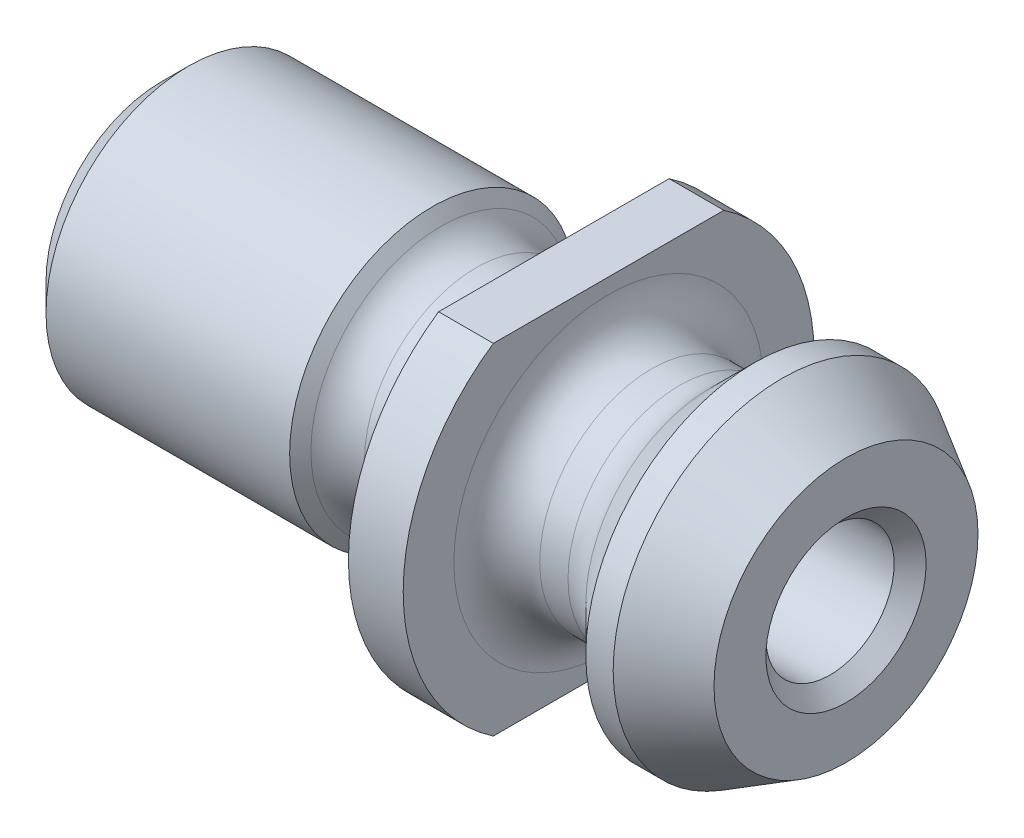
ISO-10303-21;
HEADER;
FILE_DESCRIPTION(('STEP AP214'),'2;1');
FILE_NAME('part.step','',(''),(''),'','','');
FILE_SCHEMA(('AUTOMOTIVE_DESIGN { 1 0 10303 214 1 1 1 1 }'));
ENDSEC;
DATA;
#1=APPLICATION_CONTEXT('core data for automotive mechanical design processes');
#2=APPLICATION_PROTOCOL_DEFINITION('international standard','automotive_design',2000,#1);
#3=PRODUCT_CONTEXT('',#1,'mechanical');
#4=PRODUCT('Part','Part','',(#3));
#5=PRODUCT_RELATED_PRODUCT_CATEGORY('part','',(#4));
#6=PRODUCT_DEFINITION_FORMATION('','',#4);
#7=PRODUCT_DEFINITION_CONTEXT('part definition',#1,'design');
#8=PRODUCT_DEFINITION('design','',#6,#7);
#9=PRODUCT_DEFINITION_SHAPE('','',#8);
#10=(LENGTH_UNIT() NAMED_UNIT(*) SI_UNIT(.MILLI.,.METRE.));
#11=(NAMED_UNIT(*) PLANE_ANGLE_UNIT() SI_UNIT($,.RADIAN.));
#12=(NAMED_UNIT(*) SI_UNIT($,.STERADIAN.) SOLID_ANGLE_UNIT());
#13=UNCERTAINTY_MEASURE_WITH_UNIT(LENGTH_MEASURE(1.E-05),#10,'distance_accuracy_value','');
#14=(GEOMETRIC_REPRESENTATION_CONTEXT(3) GLOBAL_UNCERTAINTY_ASSIGNED_CONTEXT((#13)) GLOBAL_UNIT_ASSIGNED_CONTEXT((#10,
#11,#12)) REPRESENTATION_CONTEXT('',''));
#15=CARTESIAN_POINT('',(0.,0.,0.));
#16=DIRECTION('',(0.,0.,1.));
#17=DIRECTION('',(1.,0.,0.));
#18=AXIS2_PLACEMENT_3D('',#15,#16,#17);
#19=CARTESIAN_POINT('',(-19.05,9.4615,0.));
#20=DIRECTION('',(0.,-1.,0.));
#21=DIRECTION('',(0.,0.,-1.));
#22=AXIS2_PLACEMENT_3D('',#19,#20,#21);
#23=PLANE('',#22);
#24=DIRECTION('',(0.,0.,-1.));
#25=VECTOR('',#24,1.);
#26=CARTESIAN_POINT('',(-16.256,9.4615,0.));
#27=LINE('',#26,#25);
#28=CARTESIAN_POINT('',(-16.256,9.4615,-6.41287125630945));
#29=VERTEX_POINT('',#28);
#30=CARTESIAN_POINT('',(-16.256,9.4615,6.41287125630945));
#31=VERTEX_POINT('',#30);
#32=EDGE_CURVE('E127',#29,#31,#27,.F.);
#33=ORIENTED_EDGE('',*,*,#32,.T.);
#34=DIRECTION('',(-1.,0.,0.));
#35=VECTOR('',#34,1.);
#36=CARTESIAN_POINT('',(-38.1,9.4615,6.41287125630945));
#37=LINE('',#36,#35);
#38=CARTESIAN_POINT('',(-13.208,9.4615,6.41287125630945));
#39=VERTEX_POINT('',#38);
#40=EDGE_CURVE('E252',#39,#31,#37,.T.);
#41=ORIENTED_EDGE('',*,*,#40,.F.);
#42=DIRECTION('',(0.,0.,1.));
#43=VECTOR('',#42,1.);
#44=CARTESIAN_POINT('',(-13.208,9.4615,0.));
#45=LINE('',#44,#43);
#46=CARTESIAN_POINT('',(-13.208,9.4615,-6.41287125630945));
#47=VERTEX_POINT('',#46);
#48=EDGE_CURVE('E74',#39,#47,#45,.F.);
#49=ORIENTED_EDGE('',*,*,#48,.T.);
#50=DIRECTION('',(-1.,0.,0.));
#51=VECTOR('',#50,1.);
#52=CARTESIAN_POINT('',(-38.1,9.4615,-6.41287125630945));
#53=LINE('',#52,#51);
#54=EDGE_CURVE('E53',#29,#47,#53,.F.);
#55=ORIENTED_EDGE('',*,*,#54,.F.);
#56=EDGE_LOOP('',(#33,#41,#49,#55));
#57=FACE_BOUND('',#56,.T.);
#58=ADVANCED_FACE('F16',(#57),#23,.F.);
#59=CARTESIAN_POINT('',(-38.1,0.,0.));
#60=DIRECTION('',(-1.,0.,0.));
#61=DIRECTION('',(0.,0.,1.));
#62=AXIS2_PLACEMENT_3D('',#59,#60,#61);
#63=CYLINDRICAL_SURFACE('',#62,11.43);
#64=ORIENTED_EDGE('',*,*,#40,.T.);
#65=CARTESIAN_POINT('',(-16.256,0.,0.));
#66=DIRECTION('',(-1.,0.,0.));
#67=DIRECTION('',(0.,0.,1.));
#68=AXIS2_PLACEMENT_3D('',#65,#66,#67);
#69=CIRCLE('',#68,11.43);
#70=CARTESIAN_POINT('',(-16.256,-9.4615,6.41287125630945));
#71=VERTEX_POINT('',#70);
#72=EDGE_CURVE('E126',#31,#71,#69,.F.);
#73=ORIENTED_EDGE('',*,*,#72,.T.);
#74=DIRECTION('',(1.,0.,0.));
#75=VECTOR('',#74,1.);
#76=CARTESIAN_POINT('',(-19.05,-9.4615,6.41287125630945));
#77=LINE('',#76,#75);
#78=CARTESIAN_POINT('',(-13.208,-9.4615,6.41287125630945));
#79=VERTEX_POINT('',#78);
#80=EDGE_CURVE('E63',#71,#79,#77,.T.);
#81=ORIENTED_EDGE('',*,*,#80,.T.);
#82=CARTESIAN_POINT('',(-13.208,0.,0.));
#83=DIRECTION('',(-1.,0.,0.));
#84=DIRECTION('',(0.,0.,1.));
#85=AXIS2_PLACEMENT_3D('',#82,#83,#84);
#86=CIRCLE('',#85,11.43);
#87=EDGE_CURVE('E71',#79,#39,#86,.T.);
#88=ORIENTED_EDGE('',*,*,#87,.T.);
#89=EDGE_LOOP('',(#64,#73,#81,#88));
#90=FACE_BOUND('',#89,.T.);
#91=ADVANCED_FACE('F153',(#90),#63,.T.);
#92=CARTESIAN_POINT('',(-19.05,-9.4615,0.));
#93=DIRECTION('',(0.,1.,0.));
#94=DIRECTION('',(0.,0.,1.));
#95=AXIS2_PLACEMENT_3D('',#92,#93,#94);
#96=PLANE('',#95);
#97=DIRECTION('',(0.,0.,-1.));
#98=VECTOR('',#97,1.);
#99=CARTESIAN_POINT('',(-16.256,-9.4615,0.));
#100=LINE('',#99,#98);
#101=CARTESIAN_POINT('',(-16.256,-9.4615,-6.41287125630945));
#102=VERTEX_POINT('',#101);
#103=EDGE_CURVE('E62',#71,#102,#100,.T.);
#104=ORIENTED_EDGE('',*,*,#103,.T.);
#105=DIRECTION('',(-1.,0.,0.));
#106=VECTOR('',#105,1.);
#107=CARTESIAN_POINT('',(-38.1,-9.4615,-6.41287125630945));
#108=LINE('',#107,#106);
#109=CARTESIAN_POINT('',(-13.208,-9.4615,-6.41287125630945));
#110=VERTEX_POINT('',#109);
#111=EDGE_CURVE('E34',#110,#102,#108,.T.);
#112=ORIENTED_EDGE('',*,*,#111,.F.);
#113=DIRECTION('',(0.,0.,1.));
#114=VECTOR('',#113,1.);
#115=CARTESIAN_POINT('',(-13.208,-9.4615,0.));
#116=LINE('',#115,#114);
#117=EDGE_CURVE('E60',#110,#79,#116,.T.);
#118=ORIENTED_EDGE('',*,*,#117,.T.);
#119=ORIENTED_EDGE('',*,*,#80,.F.);
#120=EDGE_LOOP('',(#104,#112,#118,#119));
#121=FACE_BOUND('',#120,.T.);
#122=ADVANCED_FACE('F59',(#121),#96,.F.);
#123=CARTESIAN_POINT('',(-38.1,0.,0.));
#124=DIRECTION('',(-1.,0.,0.));
#125=DIRECTION('',(0.,0.,1.));
#126=AXIS2_PLACEMENT_3D('',#123,#124,#125);
#127=CYLINDRICAL_SURFACE('',#126,11.43);
#128=ORIENTED_EDGE('',*,*,#54,.T.);
#129=CARTESIAN_POINT('',(-13.208,0.,0.));
#130=DIRECTION('',(-1.,0.,0.));
#131=DIRECTION('',(0.,0.,1.));
#132=AXIS2_PLACEMENT_3D('',#129,#130,#131);
#133=CIRCLE('',#132,11.43);
#134=EDGE_CURVE('E19',#47,#110,#133,.T.);
#135=ORIENTED_EDGE('',*,*,#134,.T.);
#136=ORIENTED_EDGE('',*,*,#111,.T.);
#137=CARTESIAN_POINT('',(-16.256,0.,0.));
#138=DIRECTION('',(-1.,0.,0.));
#139=DIRECTION('',(0.,0.,1.));
#140=AXIS2_PLACEMENT_3D('',#137,#138,#139);
#141=CIRCLE('',#140,11.43);
#142=EDGE_CURVE('E125',#102,#29,#141,.F.);
#143=ORIENTED_EDGE('',*,*,#142,.T.);
#144=EDGE_LOOP('',(#128,#135,#136,#143));
#145=FACE_BOUND('',#144,.T.);
#146=ADVANCED_FACE('F73',(#145),#127,.T.);
#147=CARTESIAN_POINT('',(-13.208,6.223,0.));
#148=DIRECTION('',(-1.,0.,0.));
#149=DIRECTION('',(0.,0.,1.));
#150=AXIS2_PLACEMENT_3D('',#147,#148,#149);
#151=PLANE('',#150);
#152=ORIENTED_EDGE('',*,*,#117,.F.);
#153=ORIENTED_EDGE('',*,*,#134,.F.);
#154=ORIENTED_EDGE('',*,*,#48,.F.);
#155=ORIENTED_EDGE('',*,*,#87,.F.);
#156=EDGE_LOOP('',(#152,#153,#154,#155));
#157=FACE_BOUND('',#156,.T.);
#158=CARTESIAN_POINT('',(-13.208,0.,0.));
#159=DIRECTION('',(1.,0.,0.));
#160=DIRECTION('',(0.,0.,1.));
#161=AXIS2_PLACEMENT_3D('',#158,#159,#160);
#162=CIRCLE('',#161,8.6106);
#163=CARTESIAN_POINT('',(-13.208,0.,8.6106));
#164=VERTEX_POINT('',#163);
#165=EDGE_CURVE('E85',#164,#164,#162,.F.);
#166=ORIENTED_EDGE('',*,*,#165,.T.);
#167=EDGE_LOOP('',(#166));
#168=FACE_BOUND('',#167,.T.);
#169=ADVANCED_FACE('F67',(#157,#168),#151,.F.);
#170=CARTESIAN_POINT('',(-16.256,11.43,0.));
#171=DIRECTION('',(1.,0.,0.));
#172=DIRECTION('',(0.,0.,-1.));
#173=AXIS2_PLACEMENT_3D('',#170,#171,#172);
#174=PLANE('',#173);
#175=ORIENTED_EDGE('',*,*,#103,.F.);
#176=ORIENTED_EDGE('',*,*,#72,.F.);
#177=ORIENTED_EDGE('',*,*,#32,.F.);
#178=ORIENTED_EDGE('',*,*,#142,.F.);
#179=EDGE_LOOP('',(#175,#176,#177,#178));
#180=FACE_BOUND('',#179,.T.);
#181=CARTESIAN_POINT('',(-16.256,0.,0.));
#182=DIRECTION('',(-1.,0.,0.));
#183=DIRECTION('',(0.,0.,-1.));
#184=AXIS2_PLACEMENT_3D('',#181,#182,#183);
#185=CIRCLE('',#184,8.6106);
#186=CARTESIAN_POINT('',(-16.256,0.,-8.6106));
#187=VERTEX_POINT('',#186);
#188=EDGE_CURVE('E115',#187,#187,#185,.F.);
#189=ORIENTED_EDGE('',*,*,#188,.T.);
#190=EDGE_LOOP('',(#189));
#191=FACE_BOUND('',#190,.T.);
#192=ADVANCED_FACE('F101',(#180,#191),#174,.F.);
#193=CARTESIAN_POINT('',(-10.8204,0.,0.));
#194=DIRECTION('',(-1.,0.,0.));
#195=DIRECTION('',(0.,0.,1.));
#196=AXIS2_PLACEMENT_3D('',#193,#194,#195);
#197=TOROIDAL_SURFACE('',#196,8.6106,2.3876);
#198=ORIENTED_EDGE('',*,*,#165,.F.);
#199=EDGE_LOOP('',(#198));
#200=FACE_BOUND('',#199,.T.);
#201=CARTESIAN_POINT('',(-10.8204,0.,0.));
#202=DIRECTION('',(-1.,0.,0.));
#203=DIRECTION('',(0.,0.,1.));
#204=AXIS2_PLACEMENT_3D('',#201,#202,#203);
#205=CIRCLE('',#204,6.223);
#206=CARTESIAN_POINT('',(-10.8204,0.,6.223));
#207=VERTEX_POINT('',#206);
#208=EDGE_CURVE('E239',#207,#207,#205,.F.);
#209=ORIENTED_EDGE('',*,*,#208,.F.);
#210=EDGE_LOOP('',(#209));
#211=FACE_BOUND('',#210,.T.);
#212=ADVANCED_FACE('F89',(#200,#211),#197,.F.);
#213=CARTESIAN_POINT('',(-18.6436,0.,0.));
#214=DIRECTION('',(1.,0.,0.));
#215=DIRECTION('',(0.,0.,-1.));
#216=AXIS2_PLACEMENT_3D('',#213,#214,#215);
#217=TOROIDAL_SURFACE('',#216,8.6106,2.3876);
#218=CARTESIAN_POINT('',(-18.6436,0.,0.));
#219=DIRECTION('',(-1.,0.,0.));
#220=DIRECTION('',(0.,0.,1.));
#221=AXIS2_PLACEMENT_3D('',#218,#219,#220);
#222=CIRCLE('',#221,6.223);
#223=CARTESIAN_POINT('',(-18.6436,0.,6.223));
#224=VERTEX_POINT('',#223);
#225=EDGE_CURVE('E234',#224,#224,#222,.T.);
#226=ORIENTED_EDGE('',*,*,#225,.F.);
#227=EDGE_LOOP('',(#226));
#228=FACE_BOUND('',#227,.T.);
#229=ORIENTED_EDGE('',*,*,#188,.F.);
#230=EDGE_LOOP('',(#229));
#231=FACE_BOUND('',#230,.T.);
#232=ADVANCED_FACE('F100',(#228,#231),#217,.F.);
#233=CARTESIAN_POINT('',(-38.1,0.,0.));
#234=DIRECTION('',(-1.,0.,0.));
#235=DIRECTION('',(0.,0.,1.));
#236=AXIS2_PLACEMENT_3D('',#233,#234,#235);
#237=CYLINDRICAL_SURFACE('',#236,6.223);
#238=ORIENTED_EDGE('',*,*,#208,.T.);
#239=EDGE_LOOP('',(#238));
#240=FACE_BOUND('',#239,.T.);
#241=CARTESIAN_POINT('',(-9.24397630152204,0.,0.));
#242=DIRECTION('',(1.,0.,0.));
#243=DIRECTION('',(0.,0.,-1.));
#244=AXIS2_PLACEMENT_3D('',#241,#242,#243);
#245=CIRCLE('',#244,6.223);
#246=CARTESIAN_POINT('',(-9.24397630152204,0.,-6.223));
#247=VERTEX_POINT('',#246);
#248=EDGE_CURVE('E228',#247,#247,#245,.F.);
#249=ORIENTED_EDGE('',*,*,#248,.T.);
#250=EDGE_LOOP('',(#249));
#251=FACE_BOUND('',#250,.T.);
#252=ADVANCED_FACE('F310',(#240,#251),#237,.T.);
#253=CARTESIAN_POINT('',(-38.1,0.,0.));
#254=DIRECTION('',(-1.,0.,0.));
#255=DIRECTION('',(0.,0.,1.));
#256=AXIS2_PLACEMENT_3D('',#253,#254,#255);
#257=CYLINDRICAL_SURFACE('',#256,6.223);
#258=CARTESIAN_POINT('',(-20.5756941101027,0.,0.));
#259=DIRECTION('',(-1.,0.,0.));
#260=DIRECTION('',(0.,0.,1.));
#261=AXIS2_PLACEMENT_3D('',#258,#259,#260);
#262=CIRCLE('',#261,6.223);
#263=CARTESIAN_POINT('',(-20.5756941101027,0.,6.223));
#264=VERTEX_POINT('',#263);
#265=EDGE_CURVE('E224',#264,#264,#262,.F.);
#266=ORIENTED_EDGE('',*,*,#265,.T.);
#267=EDGE_LOOP('',(#266));
#268=FACE_BOUND('',#267,.T.);
#269=ORIENTED_EDGE('',*,*,#225,.T.);
#270=EDGE_LOOP('',(#269));
#271=FACE_BOUND('',#270,.T.);
#272=ADVANCED_FACE('F304',(#268,#271),#257,.T.);
#273=CARTESIAN_POINT('',(-9.24397630152204,0.,0.));
#274=DIRECTION('',(1.,0.,0.));
#275=DIRECTION('',(0.,0.,-1.));
#276=AXIS2_PLACEMENT_3D('',#273,#274,#275);
#277=TOROIDAL_SURFACE('',#276,8.6106,2.3876);
#278=ORIENTED_EDGE('',*,*,#248,.F.);
#279=EDGE_LOOP('',(#278));
#280=FACE_BOUND('',#279,.T.);
#281=CARTESIAN_POINT('',(-7.55568815298284,0.,0.));
#282=DIRECTION('',(1.,0.,0.));
#283=DIRECTION('',(0.,0.,-1.));
#284=AXIS2_PLACEMENT_3D('',#281,#282,#283);
#285=CIRCLE('',#284,6.92231185146078);
#286=CARTESIAN_POINT('',(-7.55568815298284,0.,-6.92231185146078));
#287=VERTEX_POINT('',#286);
#288=EDGE_CURVE('E227',#287,#287,#285,.T.);
#289=ORIENTED_EDGE('',*,*,#288,.F.);
#290=EDGE_LOOP('',(#289));
#291=FACE_BOUND('',#290,.T.);
#292=ADVANCED_FACE('F215',(#280,#291),#277,.F.);
#293=CARTESIAN_POINT('',(-20.5756941101027,0.,0.));
#294=DIRECTION('',(-1.,0.,0.));
#295=DIRECTION('',(0.,0.,1.));
#296=AXIS2_PLACEMENT_3D('',#293,#294,#295);
#297=TOROIDAL_SURFACE('',#296,8.6106,2.3876);
#298=CARTESIAN_POINT('',(-22.531501532228,0.,0.));
#299=DIRECTION('',(-1.,0.,0.));
#300=DIRECTION('',(0.,0.,1.));
#301=AXIS2_PLACEMENT_3D('',#298,#299,#300);
#302=CIRCLE('',#301,7.24112889980688);
#303=CARTESIAN_POINT('',(-22.531501532228,0.,7.24112889980688));
#304=VERTEX_POINT('',#303);
#305=EDGE_CURVE('E293',#304,#304,#302,.T.);
#306=ORIENTED_EDGE('',*,*,#305,.F.);
#307=EDGE_LOOP('',(#306));
#308=FACE_BOUND('',#307,.T.);
#309=ORIENTED_EDGE('',*,*,#265,.F.);
#310=EDGE_LOOP('',(#309));
#311=FACE_BOUND('',#310,.T.);
#312=ADVANCED_FACE('F210',(#308,#311),#297,.F.);
#313=CARTESIAN_POINT('',(-5.08,0.,0.));
#314=DIRECTION('',(1.,0.,0.));
#315=DIRECTION('',(0.,0.,-1.));
#316=AXIS2_PLACEMENT_3D('',#313,#314,#315);
#317=CONICAL_SURFACE('',#316,9.398,0.785398162499996);
#318=CARTESIAN_POINT('',(-5.08,0.,0.));
#319=DIRECTION('',(-1.,0.,0.));
#320=DIRECTION('',(0.,0.,1.));
#321=AXIS2_PLACEMENT_3D('',#318,#319,#320);
#322=CIRCLE('',#321,9.398);
#323=CARTESIAN_POINT('',(-5.08,0.,9.398));
#324=VERTEX_POINT('',#323);
#325=EDGE_CURVE('E288',#324,#324,#322,.F.);
#326=ORIENTED_EDGE('',*,*,#325,.F.);
#327=EDGE_LOOP('',(#326));
#328=FACE_BOUND('',#327,.T.);
#329=ORIENTED_EDGE('',*,*,#288,.T.);
#330=EDGE_LOOP('',(#329));
#331=FACE_BOUND('',#330,.T.);
#332=ADVANCED_FACE('F206',(#328,#331),#317,.T.);
#333=CARTESIAN_POINT('',(-23.0191058262221,0.,0.));
#334=DIRECTION('',(-1.,0.,0.));
#335=DIRECTION('',(0.,0.,1.));
#336=AXIS2_PLACEMENT_3D('',#333,#334,#335);
#337=CONICAL_SURFACE('',#336,7.93749999866122,0.959931087455142);
#338=CARTESIAN_POINT('',(-23.0191058242605,0.,0.));
#339=DIRECTION('',(-1.,0.,0.));
#340=DIRECTION('',(0.,0.,1.));
#341=AXIS2_PLACEMENT_3D('',#338,#339,#340);
#342=CIRCLE('',#341,7.9375);
#343=CARTESIAN_POINT('',(-23.0191058242605,0.,7.9375));
#344=VERTEX_POINT('',#343);
#345=EDGE_CURVE('E276',#344,#344,#342,.T.);
#346=ORIENTED_EDGE('',*,*,#345,.F.);
#347=EDGE_LOOP('',(#346));
#348=FACE_BOUND('',#347,.T.);
#349=ORIENTED_EDGE('',*,*,#305,.T.);
#350=EDGE_LOOP('',(#349));
#351=FACE_BOUND('',#350,.T.);
#352=ADVANCED_FACE('F202',(#348,#351),#337,.T.);
#353=CARTESIAN_POINT('',(-38.1,0.,0.));
#354=DIRECTION('',(-1.,0.,0.));
#355=DIRECTION('',(0.,0.,1.));
#356=AXIS2_PLACEMENT_3D('',#353,#354,#355);
#357=CYLINDRICAL_SURFACE('',#356,9.398);
#358=ORIENTED_EDGE('',*,*,#325,.T.);
#359=EDGE_LOOP('',(#358));
#360=FACE_BOUND('',#359,.T.);
#361=CARTESIAN_POINT('',(-3.556,0.,0.));
#362=DIRECTION('',(-1.,0.,0.));
#363=DIRECTION('',(0.,0.,1.));
#364=AXIS2_PLACEMENT_3D('',#361,#362,#363);
#365=CIRCLE('',#364,9.398);
#366=CARTESIAN_POINT('',(-3.556,0.,9.398));
#367=VERTEX_POINT('',#366);
#368=EDGE_CURVE('E271',#367,#367,#365,.F.);
#369=ORIENTED_EDGE('',*,*,#368,.F.);
#370=EDGE_LOOP('',(#369));
#371=FACE_BOUND('',#370,.T.);
#372=ADVANCED_FACE('F198',(#360,#371),#357,.T.);
#373=CARTESIAN_POINT('',(-38.1,0.,0.));
#374=DIRECTION('',(-1.,0.,0.));
#375=DIRECTION('',(0.,0.,1.));
#376=AXIS2_PLACEMENT_3D('',#373,#374,#375);
#377=CYLINDRICAL_SURFACE('',#376,7.9375);
#378=ORIENTED_EDGE('',*,*,#345,.T.);
#379=EDGE_LOOP('',(#378));
#380=FACE_BOUND('',#379,.T.);
#381=CARTESIAN_POINT('',(-36.5759999986608,0.,0.));
#382=DIRECTION('',(1.,0.,0.));
#383=DIRECTION('',(0.,0.,-1.));
#384=AXIS2_PLACEMENT_3D('',#381,#382,#383);
#385=CIRCLE('',#384,7.93749999871807);
#386=CARTESIAN_POINT('',(-36.5759999986608,0.,-7.93749999871807));
#387=VERTEX_POINT('',#386);
#388=EDGE_CURVE('E267',#387,#387,#385,.F.);
#389=ORIENTED_EDGE('',*,*,#388,.F.);
#390=EDGE_LOOP('',(#389));
#391=FACE_BOUND('',#390,.T.);
#392=ADVANCED_FACE('F194',(#380,#391),#377,.T.);
#393=CARTESIAN_POINT('',(-3.556,0.,0.));
#394=DIRECTION('',(-1.,0.,0.));
#395=DIRECTION('',(0.,-1.,0.));
#396=AXIS2_PLACEMENT_3D('',#393,#394,#395);
#397=CONICAL_SURFACE('',#396,9.398,0.523598774999998);
#398=ORIENTED_EDGE('',*,*,#368,.T.);
#399=EDGE_LOOP('',(#398));
#400=FACE_BOUND('',#399,.T.);
#401=CARTESIAN_POINT('',(1.22833731033833E-09,0.,0.));
#402=DIRECTION('',(-1.,0.,0.));
#403=DIRECTION('',(0.,-1.,0.));
#404=AXIS2_PLACEMENT_3D('',#401,#402,#403);
#405=CIRCLE('',#404,7.34494244488925);
#406=CARTESIAN_POINT('',(1.22833714086818E-09,-7.34494244488925,0.));
#407=VERTEX_POINT('',#406);
#408=EDGE_CURVE('E249',#407,#407,#405,.T.);
#409=ORIENTED_EDGE('',*,*,#408,.T.);
#410=EDGE_LOOP('',(#409));
#411=FACE_BOUND('',#410,.T.);
#412=ADVANCED_FACE('F190',(#400,#411),#397,.T.);
#413=CARTESIAN_POINT('',(-36.5759999985471,0.,0.));
#414=DIRECTION('',(1.,0.,0.));
#415=DIRECTION('',(0.,0.,-1.));
#416=AXIS2_PLACEMENT_3D('',#413,#414,#415);
#417=CONICAL_SURFACE('',#416,7.93749999877491,0.785398162502276);
#418=CARTESIAN_POINT('',(-38.0999999999858,0.,0.));
#419=DIRECTION('',(1.,0.,0.));
#420=DIRECTION('',(0.,0.,-1.));
#421=AXIS2_PLACEMENT_3D('',#418,#419,#420);
#422=CIRCLE('',#421,6.41350000006469);
#423=CARTESIAN_POINT('',(-38.0999999999858,0.,-6.41350000006469));
#424=VERTEX_POINT('',#423);
#425=EDGE_CURVE('E262',#424,#424,#422,.F.);
#426=ORIENTED_EDGE('',*,*,#425,.F.);
#427=EDGE_LOOP('',(#426));
#428=FACE_BOUND('',#427,.T.);
#429=ORIENTED_EDGE('',*,*,#388,.T.);
#430=EDGE_LOOP('',(#429));
#431=FACE_BOUND('',#430,.T.);
#432=ADVANCED_FACE('F186',(#428,#431),#417,.T.);
#433=CARTESIAN_POINT('',(0.,0.,0.));
#434=DIRECTION('',(-1.,0.,0.));
#435=DIRECTION('',(0.,0.,1.));
#436=AXIS2_PLACEMENT_3D('',#433,#434,#435);
#437=PLANE('',#436);
#438=ORIENTED_EDGE('',*,*,#408,.F.);
#439=EDGE_LOOP('',(#438));
#440=FACE_BOUND('',#439,.T.);
#441=CARTESIAN_POINT('',(5.6843418860808E-11,0.,0.));
#442=DIRECTION('',(1.,0.,0.));
#443=DIRECTION('',(0.,0.,-1.));
#444=AXIS2_PLACEMENT_3D('',#441,#442,#443);
#445=CIRCLE('',#444,4.45769999993217);
#446=CARTESIAN_POINT('',(5.6843418860808E-11,0.,-4.45769999993217));
#447=VERTEX_POINT('',#446);
#448=EDGE_CURVE('E260',#447,#447,#445,.F.);
#449=ORIENTED_EDGE('',*,*,#448,.T.);
#450=EDGE_LOOP('',(#449));
#451=FACE_BOUND('',#450,.T.);
#452=ADVANCED_FACE('F182',(#440,#451),#437,.F.);
#453=CARTESIAN_POINT('',(-38.1,0.,0.));
#454=DIRECTION('',(-1.,0.,0.));
#455=DIRECTION('',(0.,0.,1.));
#456=AXIS2_PLACEMENT_3D('',#453,#454,#455);
#457=PLANE('',#456);
#458=CARTESIAN_POINT('',(-38.0999999999858,0.,0.));
#459=DIRECTION('',(-1.,0.,0.));
#460=DIRECTION('',(0.,0.,1.));
#461=AXIS2_PLACEMENT_3D('',#458,#459,#460);
#462=CIRCLE('',#461,4.45769999993217);
#463=CARTESIAN_POINT('',(-38.0999999999858,0.,4.45769999993217));
#464=VERTEX_POINT('',#463);
#465=EDGE_CURVE('E257',#464,#464,#462,.F.);
#466=ORIENTED_EDGE('',*,*,#465,.T.);
#467=EDGE_LOOP('',(#466));
#468=FACE_BOUND('',#467,.T.);
#469=ORIENTED_EDGE('',*,*,#425,.T.);
#470=EDGE_LOOP('',(#469));
#471=FACE_BOUND('',#470,.T.);
#472=ADVANCED_FACE('F178',(#468,#471),#457,.T.);
#473=CARTESIAN_POINT('',(5.6843418860808E-11,0.,0.));
#474=DIRECTION('',(1.,0.,0.));
#475=DIRECTION('',(0.,0.,-1.));
#476=AXIS2_PLACEMENT_3D('',#473,#474,#475);
#477=CONICAL_SURFACE('',#476,4.45769999993217,0.785398162502276);
#478=ORIENTED_EDGE('',*,*,#448,.F.);
#479=EDGE_LOOP('',(#478));
#480=FACE_BOUND('',#479,.T.);
#481=CARTESIAN_POINT('',(-0.889000000000001,0.,0.));
#482=DIRECTION('',(1.,0.,0.));
#483=DIRECTION('',(0.,0.,-1.));
#484=AXIS2_PLACEMENT_3D('',#481,#482,#483);
#485=CIRCLE('',#484,3.5687);
#486=CARTESIAN_POINT('',(-0.889000000000001,0.,-3.5687));
#487=VERTEX_POINT('',#486);
#488=EDGE_CURVE('E25',#487,#487,#485,.F.);
#489=ORIENTED_EDGE('',*,*,#488,.T.);
#490=EDGE_LOOP('',(#489));
#491=FACE_BOUND('',#490,.T.);
#492=ADVANCED_FACE('F170',(#480,#491),#477,.F.);
#493=CARTESIAN_POINT('',(-38.099999999929,0.,0.));
#494=DIRECTION('',(-1.,0.,0.));
#495=DIRECTION('',(0.,0.,1.));
#496=AXIS2_PLACEMENT_3D('',#493,#494,#495);
#497=CONICAL_SURFACE('',#496,4.45769999987533,0.785398162470306);
#498=ORIENTED_EDGE('',*,*,#465,.F.);
#499=EDGE_LOOP('',(#498));
#500=FACE_BOUND('',#499,.T.);
#501=CARTESIAN_POINT('',(-37.211,0.,0.));
#502=DIRECTION('',(1.,0.,0.));
#503=DIRECTION('',(0.,0.,-1.));
#504=AXIS2_PLACEMENT_3D('',#501,#502,#503);
#505=CIRCLE('',#504,3.5687);
#506=CARTESIAN_POINT('',(-37.211,0.,-3.5687));
#507=VERTEX_POINT('',#506);
#508=EDGE_CURVE('E11',#507,#507,#505,.T.);
#509=ORIENTED_EDGE('',*,*,#508,.T.);
#510=EDGE_LOOP('',(#509));
#511=FACE_BOUND('',#510,.T.);
#512=ADVANCED_FACE('F163',(#500,#511),#497,.F.);
#513=CARTESIAN_POINT('',(-38.1,0.,0.));
#514=DIRECTION('',(1.,0.,0.));
#515=DIRECTION('',(0.,0.,-1.));
#516=AXIS2_PLACEMENT_3D('',#513,#514,#515);
#517=CYLINDRICAL_SURFACE('',#516,3.5687);
#518=ORIENTED_EDGE('',*,*,#508,.F.);
#519=EDGE_LOOP('',(#518));
#520=FACE_BOUND('',#519,.T.);
#521=ORIENTED_EDGE('',*,*,#488,.F.);
#522=EDGE_LOOP('',(#521));
#523=FACE_BOUND('',#522,.T.);
#524=ADVANCED_FACE('F161',(#520,#523),#517,.F.);
#525=CLOSED_SHELL('',(#58,#91,#122,#146,#169,#192,#212,#232,#252,#272,#292,#312,#332,#352,#372,
#392,#412,#432,#452,#472,#492,#512,#524));
#526=MANIFOLD_SOLID_BREP('B1',#525);
#527=ADVANCED_BREP_SHAPE_REPRESENTATION('',(#18,#526),#14);
#528=SHAPE_DEFINITION_REPRESENTATION(#9,#527);
ENDSEC;
END-ISO-10303-21;
